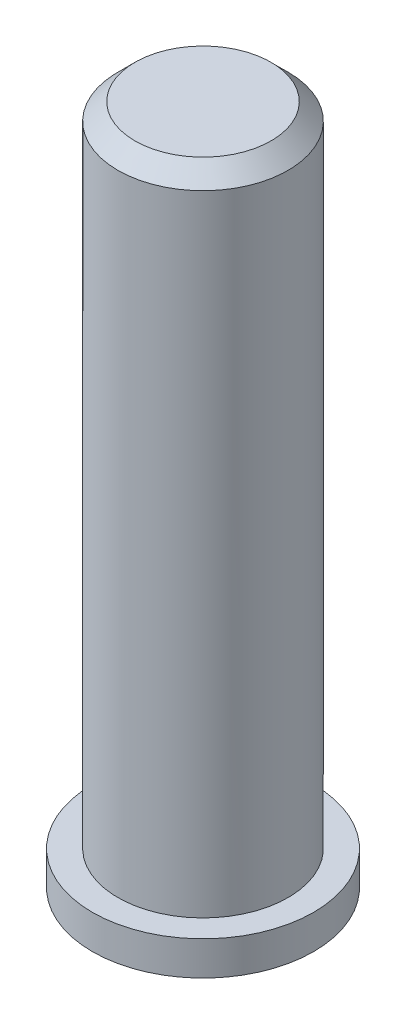
ISO-10303-21;
HEADER;
FILE_DESCRIPTION(('STEP AP214'),'2;1');
FILE_NAME('part.step','',(''),(''),'','','');
FILE_SCHEMA(('AUTOMOTIVE_DESIGN { 1 0 10303 214 1 1 1 1 }'));
ENDSEC;
DATA;
#1=APPLICATION_CONTEXT('core data for automotive mechanical design processes');
#2=APPLICATION_PROTOCOL_DEFINITION('international standard','automotive_design',2000,#1);
#3=PRODUCT_CONTEXT('',#1,'mechanical');
#4=PRODUCT('Part','Part','',(#3));
#5=PRODUCT_RELATED_PRODUCT_CATEGORY('part','',(#4));
#6=PRODUCT_DEFINITION_FORMATION('','',#4);
#7=PRODUCT_DEFINITION_CONTEXT('part definition',#1,'design');
#8=PRODUCT_DEFINITION('design','',#6,#7);
#9=PRODUCT_DEFINITION_SHAPE('','',#8);
#10=(LENGTH_UNIT() NAMED_UNIT(*) SI_UNIT(.MILLI.,.METRE.));
#11=(NAMED_UNIT(*) PLANE_ANGLE_UNIT() SI_UNIT($,.RADIAN.));
#12=(NAMED_UNIT(*) SI_UNIT($,.STERADIAN.) SOLID_ANGLE_UNIT());
#13=UNCERTAINTY_MEASURE_WITH_UNIT(LENGTH_MEASURE(1.E-05),#10,'distance_accuracy_value','');
#14=(GEOMETRIC_REPRESENTATION_CONTEXT(3) GLOBAL_UNCERTAINTY_ASSIGNED_CONTEXT((#13)) GLOBAL_UNIT_ASSIGNED_CONTEXT((#10,
#11,#12)) REPRESENTATION_CONTEXT('',''));
#15=CARTESIAN_POINT('',(0.,0.,0.));
#16=DIRECTION('',(0.,0.,1.));
#17=DIRECTION('',(1.,0.,0.));
#18=AXIS2_PLACEMENT_3D('',#15,#16,#17);
#19=CARTESIAN_POINT('',(0.,0.,0.));
#20=DIRECTION('',(0.,1.,0.));
#21=DIRECTION('',(0.,0.,1.));
#22=AXIS2_PLACEMENT_3D('',#19,#20,#21);
#23=PLANE('',#22);
#24=CARTESIAN_POINT('',(0.,0.,0.));
#25=DIRECTION('',(0.,-1.,0.));
#26=DIRECTION('',(0.,0.,-1.));
#27=AXIS2_PLACEMENT_3D('',#24,#25,#26);
#28=CIRCLE('',#27,3.25);
#29=CARTESIAN_POINT('',(0.,0.,-3.25));
#30=VERTEX_POINT('',#29);
#31=EDGE_CURVE('E49',#30,#30,#28,.T.);
#32=ORIENTED_EDGE('',*,*,#31,.T.);
#33=EDGE_LOOP('',(#32));
#34=FACE_BOUND('',#33,.T.);
#35=CARTESIAN_POINT('',(0.,0.,0.));
#36=DIRECTION('',(0.,1.,0.));
#37=DIRECTION('',(0.,0.,1.));
#38=AXIS2_PLACEMENT_3D('',#35,#36,#37);
#39=CIRCLE('',#38,0.375);
#40=CARTESIAN_POINT('',(0.,0.,0.375));
#41=VERTEX_POINT('',#40);
#42=EDGE_CURVE('E10',#41,#41,#39,.F.);
#43=ORIENTED_EDGE('',*,*,#42,.F.);
#44=EDGE_LOOP('',(#43));
#45=FACE_BOUND('',#44,.T.);
#46=ADVANCED_FACE('F26',(#34,#45),#23,.F.);
#47=CARTESIAN_POINT('',(0.,20.,0.));
#48=DIRECTION('',(0.,-1.,0.));
#49=DIRECTION('',(0.,0.,-1.));
#50=AXIS2_PLACEMENT_3D('',#47,#48,#49);
#51=CYLINDRICAL_SURFACE('',#50,2.5);
#52=CARTESIAN_POINT('',(0.,19.5,0.));
#53=DIRECTION('',(0.,1.,0.));
#54=DIRECTION('',(0.,0.,1.));
#55=AXIS2_PLACEMENT_3D('',#52,#53,#54);
#56=CIRCLE('',#55,2.5);
#57=CARTESIAN_POINT('',(0.,19.5,2.5));
#58=VERTEX_POINT('',#57);
#59=EDGE_CURVE('E37',#58,#58,#56,.F.);
#60=ORIENTED_EDGE('',*,*,#59,.T.);
#61=EDGE_LOOP('',(#60));
#62=FACE_BOUND('',#61,.T.);
#63=CARTESIAN_POINT('',(0.,1.,0.));
#64=DIRECTION('',(0.,-1.,0.));
#65=DIRECTION('',(0.,0.,-1.));
#66=AXIS2_PLACEMENT_3D('',#63,#64,#65);
#67=CIRCLE('',#66,2.5);
#68=CARTESIAN_POINT('',(0.,1.,-2.5));
#69=VERTEX_POINT('',#68);
#70=EDGE_CURVE('E33',#69,#69,#67,.T.);
#71=ORIENTED_EDGE('',*,*,#70,.F.);
#72=EDGE_LOOP('',(#71));
#73=FACE_BOUND('',#72,.T.);
#74=ADVANCED_FACE('F28',(#62,#73),#51,.T.);
#75=CARTESIAN_POINT('',(0.,20.,0.));
#76=DIRECTION('',(0.,1.,0.));
#77=DIRECTION('',(0.,0.,1.));
#78=AXIS2_PLACEMENT_3D('',#75,#76,#77);
#79=PLANE('',#78);
#80=CARTESIAN_POINT('',(0.,20.,0.));
#81=DIRECTION('',(0.,1.,0.));
#82=DIRECTION('',(0.,0.,1.));
#83=AXIS2_PLACEMENT_3D('',#80,#81,#82);
#84=CIRCLE('',#83,2.);
#85=CARTESIAN_POINT('',(0.,20.,2.));
#86=VERTEX_POINT('',#85);
#87=EDGE_CURVE('E41',#86,#86,#84,.T.);
#88=ORIENTED_EDGE('',*,*,#87,.T.);
#89=EDGE_LOOP('',(#88));
#90=FACE_BOUND('',#89,.T.);
#91=ADVANCED_FACE('F77',(#90),#79,.T.);
#92=CARTESIAN_POINT('',(0.,20.,0.));
#93=DIRECTION('',(0.,-1.,0.));
#94=DIRECTION('',(0.,0.,-1.));
#95=AXIS2_PLACEMENT_3D('',#92,#93,#94);
#96=CONICAL_SURFACE('',#95,2.,0.785398163397443);
#97=ORIENTED_EDGE('',*,*,#59,.F.);
#98=EDGE_LOOP('',(#97));
#99=FACE_BOUND('',#98,.T.);
#100=ORIENTED_EDGE('',*,*,#87,.F.);
#101=EDGE_LOOP('',(#100));
#102=FACE_BOUND('',#101,.T.);
#103=ADVANCED_FACE('F81',(#99,#102),#96,.T.);
#104=CARTESIAN_POINT('',(0.,1.,0.));
#105=DIRECTION('',(0.,-1.,0.));
#106=DIRECTION('',(0.,0.,-1.));
#107=AXIS2_PLACEMENT_3D('',#104,#105,#106);
#108=PLANE('',#107);
#109=CARTESIAN_POINT('',(0.,1.,0.));
#110=DIRECTION('',(0.,-1.,0.));
#111=DIRECTION('',(0.,0.,-1.));
#112=AXIS2_PLACEMENT_3D('',#109,#110,#111);
#113=CIRCLE('',#112,3.25);
#114=CARTESIAN_POINT('',(0.,1.,-3.25));
#115=VERTEX_POINT('',#114);
#116=EDGE_CURVE('E46',#115,#115,#113,.T.);
#117=ORIENTED_EDGE('',*,*,#116,.F.);
#118=EDGE_LOOP('',(#117));
#119=FACE_BOUND('',#118,.T.);
#120=ORIENTED_EDGE('',*,*,#70,.T.);
#121=EDGE_LOOP('',(#120));
#122=FACE_BOUND('',#121,.T.);
#123=ADVANCED_FACE('F68',(#119,#122),#108,.F.);
#124=CARTESIAN_POINT('',(0.,1.,0.));
#125=DIRECTION('',(0.,-1.,0.));
#126=DIRECTION('',(0.,0.,-1.));
#127=AXIS2_PLACEMENT_3D('',#124,#125,#126);
#128=CYLINDRICAL_SURFACE('',#127,3.25);
#129=ORIENTED_EDGE('',*,*,#116,.T.);
#130=EDGE_LOOP('',(#129));
#131=FACE_BOUND('',#130,.T.);
#132=ORIENTED_EDGE('',*,*,#31,.F.);
#133=EDGE_LOOP('',(#132));
#134=FACE_BOUND('',#133,.T.);
#135=ADVANCED_FACE('F60',(#131,#134),#128,.T.);
#136=CARTESIAN_POINT('',(0.,-0.8,0.));
#137=DIRECTION('',(0.,1.,0.));
#138=DIRECTION('',(0.,0.,1.));
#139=AXIS2_PLACEMENT_3D('',#136,#137,#138);
#140=CYLINDRICAL_SURFACE('',#139,0.375);
#141=CARTESIAN_POINT('',(0.,-0.8,0.));
#142=DIRECTION('',(0.,-1.,0.));
#143=DIRECTION('',(0.,0.,-1.));
#144=AXIS2_PLACEMENT_3D('',#141,#142,#143);
#145=CIRCLE('',#144,0.375);
#146=CARTESIAN_POINT('',(0.,-0.8,-0.375));
#147=VERTEX_POINT('',#146);
#148=EDGE_CURVE('E52',#147,#147,#145,.T.);
#149=ORIENTED_EDGE('',*,*,#148,.F.);
#150=EDGE_LOOP('',(#149));
#151=FACE_BOUND('',#150,.T.);
#152=ORIENTED_EDGE('',*,*,#42,.T.);
#153=EDGE_LOOP('',(#152));
#154=FACE_BOUND('',#153,.T.);
#155=ADVANCED_FACE('F58',(#151,#154),#140,.T.);
#156=CARTESIAN_POINT('',(0.,-0.8,0.));
#157=DIRECTION('',(0.,-1.,0.));
#158=DIRECTION('',(0.,0.,-1.));
#159=AXIS2_PLACEMENT_3D('',#156,#157,#158);
#160=PLANE('',#159);
#161=ORIENTED_EDGE('',*,*,#148,.T.);
#162=EDGE_LOOP('',(#161));
#163=FACE_BOUND('',#162,.T.);
#164=ADVANCED_FACE('F56',(#163),#160,.T.);
#165=CLOSED_SHELL('',(#46,#74,#91,#103,#123,#135,#155,#164));
#166=MANIFOLD_SOLID_BREP('B2',#165);
#167=ADVANCED_BREP_SHAPE_REPRESENTATION('',(#18,#166),#14);
#168=SHAPE_DEFINITION_REPRESENTATION(#9,#167);
ENDSEC;
END-ISO-10303-21;
